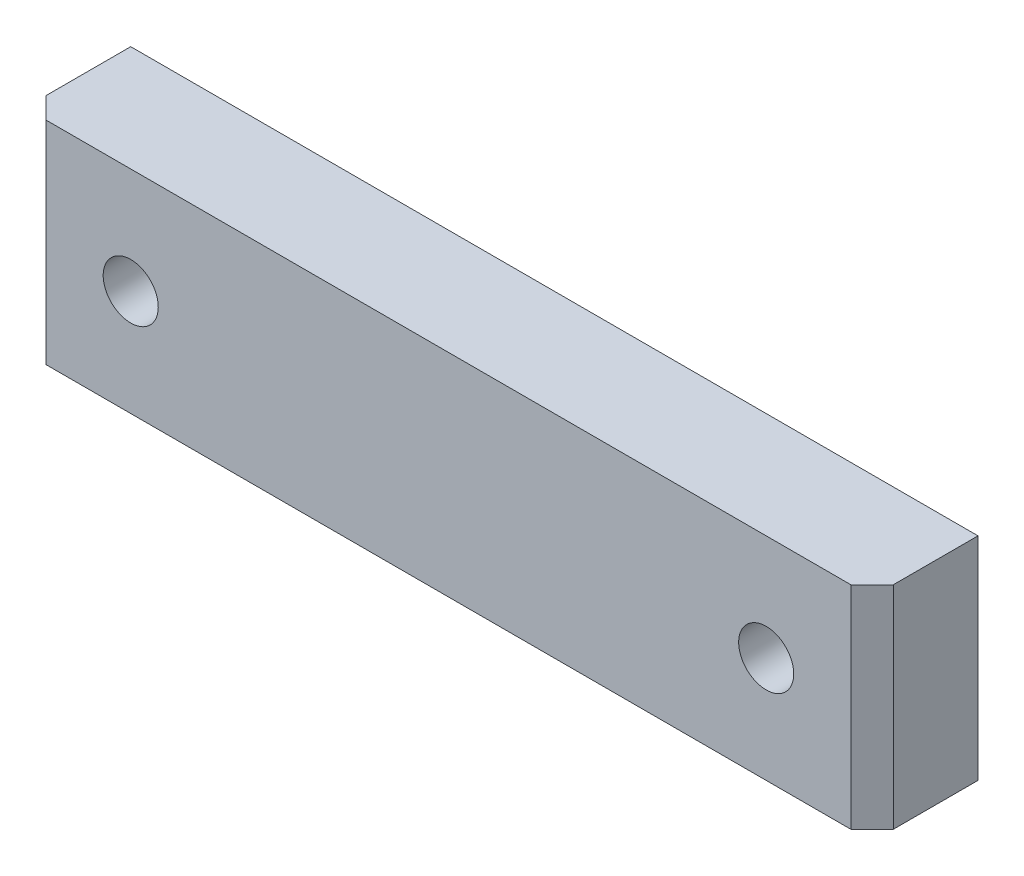
ISO-10303-21;
HEADER;
FILE_DESCRIPTION(('STEP AP214'),'2;1');
FILE_NAME('part.step','',(''),(''),'','','');
FILE_SCHEMA(('AUTOMOTIVE_DESIGN { 1 0 10303 214 1 1 1 1 }'));
ENDSEC;
DATA;
#1=APPLICATION_CONTEXT('core data for automotive mechanical design processes');
#2=APPLICATION_PROTOCOL_DEFINITION('international standard','automotive_design',2000,#1);
#3=PRODUCT_CONTEXT('',#1,'mechanical');
#4=PRODUCT('Part','Part','',(#3));
#5=PRODUCT_RELATED_PRODUCT_CATEGORY('part','',(#4));
#6=PRODUCT_DEFINITION_FORMATION('','',#4);
#7=PRODUCT_DEFINITION_CONTEXT('part definition',#1,'design');
#8=PRODUCT_DEFINITION('design','',#6,#7);
#9=PRODUCT_DEFINITION_SHAPE('','',#8);
#10=(LENGTH_UNIT() NAMED_UNIT(*) SI_UNIT(.MILLI.,.METRE.));
#11=(NAMED_UNIT(*) PLANE_ANGLE_UNIT() SI_UNIT($,.RADIAN.));
#12=(NAMED_UNIT(*) SI_UNIT($,.STERADIAN.) SOLID_ANGLE_UNIT());
#13=UNCERTAINTY_MEASURE_WITH_UNIT(LENGTH_MEASURE(1.E-05),#10,'distance_accuracy_value','');
#14=(GEOMETRIC_REPRESENTATION_CONTEXT(3) GLOBAL_UNCERTAINTY_ASSIGNED_CONTEXT((#13)) GLOBAL_UNIT_ASSIGNED_CONTEXT((#10,
#11,#12)) REPRESENTATION_CONTEXT('',''));
#15=CARTESIAN_POINT('',(0.,0.,0.));
#16=DIRECTION('',(0.,0.,1.));
#17=DIRECTION('',(1.,0.,0.));
#18=AXIS2_PLACEMENT_3D('',#15,#16,#17);
#19=CARTESIAN_POINT('',(0.,0.,10.));
#20=DIRECTION('',(0.,0.,-1.));
#21=DIRECTION('',(-1.,0.,0.));
#22=AXIS2_PLACEMENT_3D('',#19,#20,#21);
#23=PLANE('',#22);
#24=DIRECTION('',(1.,0.,0.));
#25=VECTOR('',#24,1.);
#26=CARTESIAN_POINT('',(-40.,-10.,10.));
#27=LINE('',#26,#25);
#28=CARTESIAN_POINT('',(-38.,-10.,10.));
#29=VERTEX_POINT('',#28);
#30=CARTESIAN_POINT('',(38.,-10.,10.));
#31=VERTEX_POINT('',#30);
#32=EDGE_CURVE('E179',#29,#31,#27,.T.);
#33=ORIENTED_EDGE('',*,*,#32,.T.);
#34=DIRECTION('',(0.,1.,0.));
#35=VECTOR('',#34,1.);
#36=CARTESIAN_POINT('',(38.,0.,10.));
#37=LINE('',#36,#35);
#38=CARTESIAN_POINT('',(38.,10.,10.));
#39=VERTEX_POINT('',#38);
#40=EDGE_CURVE('E213',#31,#39,#37,.T.);
#41=ORIENTED_EDGE('',*,*,#40,.T.);
#42=DIRECTION('',(-1.,0.,0.));
#43=VECTOR('',#42,1.);
#44=CARTESIAN_POINT('',(-40.,10.,10.));
#45=LINE('',#44,#43);
#46=CARTESIAN_POINT('',(-38.,10.,10.));
#47=VERTEX_POINT('',#46);
#48=EDGE_CURVE('E175',#39,#47,#45,.T.);
#49=ORIENTED_EDGE('',*,*,#48,.T.);
#50=DIRECTION('',(0.,-1.,0.));
#51=VECTOR('',#50,1.);
#52=CARTESIAN_POINT('',(-38.,0.,10.));
#53=LINE('',#52,#51);
#54=EDGE_CURVE('E209',#47,#29,#53,.T.);
#55=ORIENTED_EDGE('',*,*,#54,.T.);
#56=EDGE_LOOP('',(#33,#41,#49,#55));
#57=FACE_BOUND('',#56,.T.);
#58=CARTESIAN_POINT('',(-30.,0.,10.));
#59=DIRECTION('',(0.,0.,1.));
#60=DIRECTION('',(1.,0.,0.));
#61=AXIS2_PLACEMENT_3D('',#58,#59,#60);
#62=CIRCLE('',#61,2.6);
#63=CARTESIAN_POINT('',(-27.4,0.,10.));
#64=VERTEX_POINT('',#63);
#65=EDGE_CURVE('E167',#64,#64,#62,.T.);
#66=ORIENTED_EDGE('',*,*,#65,.F.);
#67=EDGE_LOOP('',(#66));
#68=FACE_BOUND('',#67,.T.);
#69=CARTESIAN_POINT('',(30.,0.,10.));
#70=DIRECTION('',(0.,0.,1.));
#71=DIRECTION('',(1.,0.,0.));
#72=AXIS2_PLACEMENT_3D('',#69,#70,#71);
#73=CIRCLE('',#72,2.6);
#74=CARTESIAN_POINT('',(32.6,0.,10.));
#75=VERTEX_POINT('',#74);
#76=EDGE_CURVE('E158',#75,#75,#73,.T.);
#77=ORIENTED_EDGE('',*,*,#76,.F.);
#78=EDGE_LOOP('',(#77));
#79=FACE_BOUND('',#78,.T.);
#80=ADVANCED_FACE('F43',(#57,#68,#79),#23,.F.);
#81=CARTESIAN_POINT('',(0.,0.,0.));
#82=DIRECTION('',(0.,0.,-1.));
#83=DIRECTION('',(-1.,0.,0.));
#84=AXIS2_PLACEMENT_3D('',#81,#82,#83);
#85=PLANE('',#84);
#86=DIRECTION('',(0.,-1.,0.));
#87=VECTOR('',#86,1.);
#88=CARTESIAN_POINT('',(15.,0.,0.));
#89=LINE('',#88,#87);
#90=CARTESIAN_POINT('',(15.,0.,0.));
#91=VERTEX_POINT('',#90);
#92=CARTESIAN_POINT('',(15.,-10.,0.));
#93=VERTEX_POINT('',#92);
#94=EDGE_CURVE('E258',#91,#93,#89,.T.);
#95=ORIENTED_EDGE('',*,*,#94,.F.);
#96=DIRECTION('',(1.,0.,0.));
#97=VECTOR('',#96,1.);
#98=CARTESIAN_POINT('',(15.,0.,0.));
#99=LINE('',#98,#97);
#100=CARTESIAN_POINT('',(-15.,0.,0.));
#101=VERTEX_POINT('',#100);
#102=EDGE_CURVE('E256',#101,#91,#99,.T.);
#103=ORIENTED_EDGE('',*,*,#102,.F.);
#104=DIRECTION('',(0.,1.,0.));
#105=VECTOR('',#104,1.);
#106=CARTESIAN_POINT('',(-15.,0.,0.));
#107=LINE('',#106,#105);
#108=CARTESIAN_POINT('',(-15.,-10.,0.));
#109=VERTEX_POINT('',#108);
#110=EDGE_CURVE('E254',#109,#101,#107,.T.);
#111=ORIENTED_EDGE('',*,*,#110,.F.);
#112=DIRECTION('',(1.,0.,0.));
#113=VECTOR('',#112,1.);
#114=CARTESIAN_POINT('',(-40.,-10.,0.));
#115=LINE('',#114,#113);
#116=CARTESIAN_POINT('',(-40.,-10.,0.));
#117=VERTEX_POINT('',#116);
#118=EDGE_CURVE('E147',#117,#109,#115,.T.);
#119=ORIENTED_EDGE('',*,*,#118,.F.);
#120=DIRECTION('',(0.,-1.,0.));
#121=VECTOR('',#120,1.);
#122=CARTESIAN_POINT('',(-40.,-10.,0.));
#123=LINE('',#122,#121);
#124=CARTESIAN_POINT('',(-40.,10.,0.));
#125=VERTEX_POINT('',#124);
#126=EDGE_CURVE('E191',#125,#117,#123,.T.);
#127=ORIENTED_EDGE('',*,*,#126,.F.);
#128=DIRECTION('',(-1.,0.,0.));
#129=VECTOR('',#128,1.);
#130=CARTESIAN_POINT('',(-40.,10.,0.));
#131=LINE('',#130,#129);
#132=CARTESIAN_POINT('',(40.,10.,0.));
#133=VERTEX_POINT('',#132);
#134=EDGE_CURVE('E187',#133,#125,#131,.T.);
#135=ORIENTED_EDGE('',*,*,#134,.F.);
#136=DIRECTION('',(0.,1.,0.));
#137=VECTOR('',#136,1.);
#138=CARTESIAN_POINT('',(40.,-10.,0.));
#139=LINE('',#138,#137);
#140=CARTESIAN_POINT('',(40.,-10.,0.));
#141=VERTEX_POINT('',#140);
#142=EDGE_CURVE('E171',#141,#133,#139,.T.);
#143=ORIENTED_EDGE('',*,*,#142,.F.);
#144=EDGE_CURVE('E195',#93,#141,#115,.T.);
#145=ORIENTED_EDGE('',*,*,#144,.F.);
#146=EDGE_LOOP('',(#95,#103,#111,#119,#127,#135,#143,#145));
#147=FACE_BOUND('',#146,.T.);
#148=CARTESIAN_POINT('',(-30.,0.,0.));
#149=DIRECTION('',(0.,0.,1.));
#150=DIRECTION('',(1.,0.,0.));
#151=AXIS2_PLACEMENT_3D('',#148,#149,#150);
#152=CIRCLE('',#151,2.6);
#153=CARTESIAN_POINT('',(-27.4,0.,0.));
#154=VERTEX_POINT('',#153);
#155=EDGE_CURVE('E162',#154,#154,#152,.T.);
#156=ORIENTED_EDGE('',*,*,#155,.T.);
#157=EDGE_LOOP('',(#156));
#158=FACE_BOUND('',#157,.T.);
#159=CARTESIAN_POINT('',(30.,0.,0.));
#160=DIRECTION('',(0.,0.,1.));
#161=DIRECTION('',(1.,0.,0.));
#162=AXIS2_PLACEMENT_3D('',#159,#160,#161);
#163=CIRCLE('',#162,2.6);
#164=CARTESIAN_POINT('',(32.6,0.,0.));
#165=VERTEX_POINT('',#164);
#166=EDGE_CURVE('E163',#165,#165,#163,.T.);
#167=ORIENTED_EDGE('',*,*,#166,.T.);
#168=EDGE_LOOP('',(#167));
#169=FACE_BOUND('',#168,.T.);
#170=ADVANCED_FACE('F244',(#147,#158,#169),#85,.T.);
#171=CARTESIAN_POINT('',(40.,-10.,10.));
#172=DIRECTION('',(-1.,0.,0.));
#173=DIRECTION('',(0.,0.,1.));
#174=AXIS2_PLACEMENT_3D('',#171,#172,#173);
#175=PLANE('',#174);
#176=DIRECTION('',(0.,0.,-1.));
#177=VECTOR('',#176,1.);
#178=CARTESIAN_POINT('',(40.,10.,10.));
#179=LINE('',#178,#177);
#180=CARTESIAN_POINT('',(40.,10.,7.99999999999998));
#181=VERTEX_POINT('',#180);
#182=EDGE_CURVE('E206',#181,#133,#179,.T.);
#183=ORIENTED_EDGE('',*,*,#182,.F.);
#184=DIRECTION('',(0.,-1.,0.));
#185=VECTOR('',#184,1.);
#186=CARTESIAN_POINT('',(40.,-10.,7.99999999999998));
#187=LINE('',#186,#185);
#188=CARTESIAN_POINT('',(40.,-10.,7.99999999999998));
#189=VERTEX_POINT('',#188);
#190=EDGE_CURVE('E68',#181,#189,#187,.T.);
#191=ORIENTED_EDGE('',*,*,#190,.T.);
#192=DIRECTION('',(0.,0.,-1.));
#193=VECTOR('',#192,1.);
#194=CARTESIAN_POINT('',(40.,-10.,10.));
#195=LINE('',#194,#193);
#196=EDGE_CURVE('E183',#189,#141,#195,.T.);
#197=ORIENTED_EDGE('',*,*,#196,.T.);
#198=ORIENTED_EDGE('',*,*,#142,.T.);
#199=EDGE_LOOP('',(#183,#191,#197,#198));
#200=FACE_BOUND('',#199,.T.);
#201=ADVANCED_FACE('F239',(#200),#175,.F.);
#202=CARTESIAN_POINT('',(-40.,10.,10.));
#203=DIRECTION('',(0.,-1.,0.));
#204=DIRECTION('',(0.,0.,-1.));
#205=AXIS2_PLACEMENT_3D('',#202,#203,#204);
#206=PLANE('',#205);
#207=ORIENTED_EDGE('',*,*,#48,.F.);
#208=DIRECTION('',(-0.707106781186546,0.,0.707106781186549));
#209=VECTOR('',#208,1.);
#210=CARTESIAN_POINT('',(38.,10.,10.));
#211=LINE('',#210,#209);
#212=EDGE_CURVE('E220',#39,#181,#211,.F.);
#213=ORIENTED_EDGE('',*,*,#212,.T.);
#214=ORIENTED_EDGE('',*,*,#182,.T.);
#215=ORIENTED_EDGE('',*,*,#134,.T.);
#216=DIRECTION('',(0.,0.,-1.));
#217=VECTOR('',#216,1.);
#218=CARTESIAN_POINT('',(-40.,10.,10.));
#219=LINE('',#218,#217);
#220=CARTESIAN_POINT('',(-40.,10.,7.99999999999998));
#221=VERTEX_POINT('',#220);
#222=EDGE_CURVE('E203',#221,#125,#219,.T.);
#223=ORIENTED_EDGE('',*,*,#222,.F.);
#224=DIRECTION('',(-0.707106781186546,0.,-0.707106781186549));
#225=VECTOR('',#224,1.);
#226=CARTESIAN_POINT('',(-38.,10.,10.));
#227=LINE('',#226,#225);
#228=EDGE_CURVE('E217',#221,#47,#227,.F.);
#229=ORIENTED_EDGE('',*,*,#228,.T.);
#230=EDGE_LOOP('',(#207,#213,#214,#215,#223,#229));
#231=FACE_BOUND('',#230,.T.);
#232=ADVANCED_FACE('F237',(#231),#206,.F.);
#233=CARTESIAN_POINT('',(-40.,-10.,10.));
#234=DIRECTION('',(1.,0.,0.));
#235=DIRECTION('',(0.,0.,-1.));
#236=AXIS2_PLACEMENT_3D('',#233,#234,#235);
#237=PLANE('',#236);
#238=DIRECTION('',(0.,0.,-1.));
#239=VECTOR('',#238,1.);
#240=CARTESIAN_POINT('',(-40.,-10.,10.));
#241=LINE('',#240,#239);
#242=CARTESIAN_POINT('',(-40.,-10.,7.99999999999998));
#243=VERTEX_POINT('',#242);
#244=EDGE_CURVE('E200',#243,#117,#241,.T.);
#245=ORIENTED_EDGE('',*,*,#244,.F.);
#246=DIRECTION('',(0.,1.,0.));
#247=VECTOR('',#246,1.);
#248=CARTESIAN_POINT('',(-40.,-10.,7.99999999999998));
#249=LINE('',#248,#247);
#250=EDGE_CURVE('E11',#243,#221,#249,.T.);
#251=ORIENTED_EDGE('',*,*,#250,.T.);
#252=ORIENTED_EDGE('',*,*,#222,.T.);
#253=ORIENTED_EDGE('',*,*,#126,.T.);
#254=EDGE_LOOP('',(#245,#251,#252,#253));
#255=FACE_BOUND('',#254,.T.);
#256=ADVANCED_FACE('F252',(#255),#237,.F.);
#257=CARTESIAN_POINT('',(-40.,-10.,10.));
#258=DIRECTION('',(0.,1.,0.));
#259=DIRECTION('',(0.,0.,1.));
#260=AXIS2_PLACEMENT_3D('',#257,#258,#259);
#261=PLANE('',#260);
#262=ORIENTED_EDGE('',*,*,#196,.F.);
#263=DIRECTION('',(0.707106781186546,0.,-0.707106781186549));
#264=VECTOR('',#263,1.);
#265=CARTESIAN_POINT('',(38.,-10.,10.));
#266=LINE('',#265,#264);
#267=EDGE_CURVE('E53',#189,#31,#266,.F.);
#268=ORIENTED_EDGE('',*,*,#267,.T.);
#269=ORIENTED_EDGE('',*,*,#32,.F.);
#270=DIRECTION('',(0.707106781186546,0.,0.707106781186549));
#271=VECTOR('',#270,1.);
#272=CARTESIAN_POINT('',(-38.,-10.,10.));
#273=LINE('',#272,#271);
#274=EDGE_CURVE('E60',#29,#243,#273,.F.);
#275=ORIENTED_EDGE('',*,*,#274,.T.);
#276=ORIENTED_EDGE('',*,*,#244,.T.);
#277=ORIENTED_EDGE('',*,*,#118,.T.);
#278=DIRECTION('',(0.,0.,-1.));
#279=VECTOR('',#278,1.);
#280=CARTESIAN_POINT('',(-15.,-10.,5.));
#281=LINE('',#280,#279);
#282=CARTESIAN_POINT('',(-15.,-10.,5.));
#283=VERTEX_POINT('',#282);
#284=EDGE_CURVE('E126',#283,#109,#281,.T.);
#285=ORIENTED_EDGE('',*,*,#284,.F.);
#286=DIRECTION('',(-1.,0.,0.));
#287=VECTOR('',#286,1.);
#288=CARTESIAN_POINT('',(15.,-10.,5.));
#289=LINE('',#288,#287);
#290=CARTESIAN_POINT('',(15.,-10.,5.));
#291=VERTEX_POINT('',#290);
#292=EDGE_CURVE('E134',#291,#283,#289,.T.);
#293=ORIENTED_EDGE('',*,*,#292,.F.);
#294=DIRECTION('',(0.,0.,-1.));
#295=VECTOR('',#294,1.);
#296=CARTESIAN_POINT('',(15.,-10.,5.));
#297=LINE('',#296,#295);
#298=EDGE_CURVE('E149',#291,#93,#297,.T.);
#299=ORIENTED_EDGE('',*,*,#298,.T.);
#300=ORIENTED_EDGE('',*,*,#144,.T.);
#301=EDGE_LOOP('',(#262,#268,#269,#275,#276,#277,#285,#293,#299,#300));
#302=FACE_BOUND('',#301,.T.);
#303=ADVANCED_FACE('F145',(#302),#261,.F.);
#304=CARTESIAN_POINT('',(-30.,0.,10.));
#305=DIRECTION('',(0.,0.,-1.));
#306=DIRECTION('',(-1.,0.,0.));
#307=AXIS2_PLACEMENT_3D('',#304,#305,#306);
#308=CYLINDRICAL_SURFACE('',#307,2.6);
#309=ORIENTED_EDGE('',*,*,#65,.T.);
#310=EDGE_LOOP('',(#309));
#311=FACE_BOUND('',#310,.T.);
#312=ORIENTED_EDGE('',*,*,#155,.F.);
#313=EDGE_LOOP('',(#312));
#314=FACE_BOUND('',#313,.T.);
#315=ADVANCED_FACE('F290',(#311,#314),#308,.F.);
#316=CARTESIAN_POINT('',(30.,0.,10.));
#317=DIRECTION('',(0.,0.,-1.));
#318=DIRECTION('',(-1.,0.,0.));
#319=AXIS2_PLACEMENT_3D('',#316,#317,#318);
#320=CYLINDRICAL_SURFACE('',#319,2.6);
#321=ORIENTED_EDGE('',*,*,#76,.T.);
#322=EDGE_LOOP('',(#321));
#323=FACE_BOUND('',#322,.T.);
#324=ORIENTED_EDGE('',*,*,#166,.F.);
#325=EDGE_LOOP('',(#324));
#326=FACE_BOUND('',#325,.T.);
#327=ADVANCED_FACE('F280',(#323,#326),#320,.F.);
#328=CARTESIAN_POINT('',(15.,0.,5.));
#329=DIRECTION('',(1.,0.,0.));
#330=DIRECTION('',(0.,1.,0.));
#331=AXIS2_PLACEMENT_3D('',#328,#329,#330);
#332=PLANE('',#331);
#333=ORIENTED_EDGE('',*,*,#94,.T.);
#334=ORIENTED_EDGE('',*,*,#298,.F.);
#335=DIRECTION('',(0.,-1.,0.));
#336=VECTOR('',#335,1.);
#337=CARTESIAN_POINT('',(15.,0.,5.));
#338=LINE('',#337,#336);
#339=CARTESIAN_POINT('',(15.,0.,5.));
#340=VERTEX_POINT('',#339);
#341=EDGE_CURVE('E139',#340,#291,#338,.T.);
#342=ORIENTED_EDGE('',*,*,#341,.F.);
#343=DIRECTION('',(0.,0.,-1.));
#344=VECTOR('',#343,1.);
#345=CARTESIAN_POINT('',(15.,0.,5.));
#346=LINE('',#345,#344);
#347=EDGE_CURVE('E153',#340,#91,#346,.T.);
#348=ORIENTED_EDGE('',*,*,#347,.T.);
#349=EDGE_LOOP('',(#333,#334,#342,#348));
#350=FACE_BOUND('',#349,.T.);
#351=ADVANCED_FACE('F267',(#350),#332,.F.);
#352=CARTESIAN_POINT('',(15.,0.,5.));
#353=DIRECTION('',(0.,1.,0.));
#354=DIRECTION('',(0.,0.,1.));
#355=AXIS2_PLACEMENT_3D('',#352,#353,#354);
#356=PLANE('',#355);
#357=ORIENTED_EDGE('',*,*,#102,.T.);
#358=ORIENTED_EDGE('',*,*,#347,.F.);
#359=DIRECTION('',(1.,0.,0.));
#360=VECTOR('',#359,1.);
#361=CARTESIAN_POINT('',(15.,0.,5.));
#362=LINE('',#361,#360);
#363=CARTESIAN_POINT('',(-15.,0.,5.));
#364=VERTEX_POINT('',#363);
#365=EDGE_CURVE('E133',#364,#340,#362,.T.);
#366=ORIENTED_EDGE('',*,*,#365,.F.);
#367=DIRECTION('',(0.,0.,-1.));
#368=VECTOR('',#367,1.);
#369=CARTESIAN_POINT('',(-15.,0.,5.));
#370=LINE('',#369,#368);
#371=EDGE_CURVE('E128',#364,#101,#370,.T.);
#372=ORIENTED_EDGE('',*,*,#371,.T.);
#373=EDGE_LOOP('',(#357,#358,#366,#372));
#374=FACE_BOUND('',#373,.T.);
#375=ADVANCED_FACE('F269',(#374),#356,.F.);
#376=CARTESIAN_POINT('',(-15.,0.,5.));
#377=DIRECTION('',(-1.,0.,0.));
#378=DIRECTION('',(0.,-1.,0.));
#379=AXIS2_PLACEMENT_3D('',#376,#377,#378);
#380=PLANE('',#379);
#381=ORIENTED_EDGE('',*,*,#110,.T.);
#382=ORIENTED_EDGE('',*,*,#371,.F.);
#383=DIRECTION('',(0.,1.,0.));
#384=VECTOR('',#383,1.);
#385=CARTESIAN_POINT('',(-15.,0.,5.));
#386=LINE('',#385,#384);
#387=EDGE_CURVE('E121',#283,#364,#386,.T.);
#388=ORIENTED_EDGE('',*,*,#387,.F.);
#389=ORIENTED_EDGE('',*,*,#284,.T.);
#390=EDGE_LOOP('',(#381,#382,#388,#389));
#391=FACE_BOUND('',#390,.T.);
#392=ADVANCED_FACE('F124',(#391),#380,.F.);
#393=CARTESIAN_POINT('',(0.,0.,5.));
#394=DIRECTION('',(0.,0.,-1.));
#395=DIRECTION('',(-1.,0.,0.));
#396=AXIS2_PLACEMENT_3D('',#393,#394,#395);
#397=PLANE('',#396);
#398=ORIENTED_EDGE('',*,*,#341,.T.);
#399=ORIENTED_EDGE('',*,*,#292,.T.);
#400=ORIENTED_EDGE('',*,*,#387,.T.);
#401=ORIENTED_EDGE('',*,*,#365,.T.);
#402=EDGE_LOOP('',(#398,#399,#400,#401));
#403=FACE_BOUND('',#402,.T.);
#404=ADVANCED_FACE('F137',(#403),#397,.T.);
#405=CARTESIAN_POINT('',(38.,0.,10.));
#406=DIRECTION('',(-0.707106781186549,0.,-0.707106781186546));
#407=DIRECTION('',(0.,1.,0.));
#408=AXIS2_PLACEMENT_3D('',#405,#406,#407);
#409=PLANE('',#408);
#410=ORIENTED_EDGE('',*,*,#267,.F.);
#411=ORIENTED_EDGE('',*,*,#190,.F.);
#412=ORIENTED_EDGE('',*,*,#212,.F.);
#413=ORIENTED_EDGE('',*,*,#40,.F.);
#414=EDGE_LOOP('',(#410,#411,#412,#413));
#415=FACE_BOUND('',#414,.T.);
#416=ADVANCED_FACE('F235',(#415),#409,.F.);
#417=CARTESIAN_POINT('',(-38.,0.,10.));
#418=DIRECTION('',(0.707106781186549,0.,-0.707106781186546));
#419=DIRECTION('',(0.,-1.,0.));
#420=AXIS2_PLACEMENT_3D('',#417,#418,#419);
#421=PLANE('',#420);
#422=ORIENTED_EDGE('',*,*,#228,.F.);
#423=ORIENTED_EDGE('',*,*,#250,.F.);
#424=ORIENTED_EDGE('',*,*,#274,.F.);
#425=ORIENTED_EDGE('',*,*,#54,.F.);
#426=EDGE_LOOP('',(#422,#423,#424,#425));
#427=FACE_BOUND('',#426,.T.);
#428=ADVANCED_FACE('F46',(#427),#421,.F.);
#429=CLOSED_SHELL('',(#80,#170,#201,#232,#256,#303,#315,#327,#351,#375,#392,#404,#416,#428));
#430=MANIFOLD_SOLID_BREP('B2',#429);
#431=ADVANCED_BREP_SHAPE_REPRESENTATION('',(#18,#430),#14);
#432=SHAPE_DEFINITION_REPRESENTATION(#9,#431);
ENDSEC;
END-ISO-10303-21;
